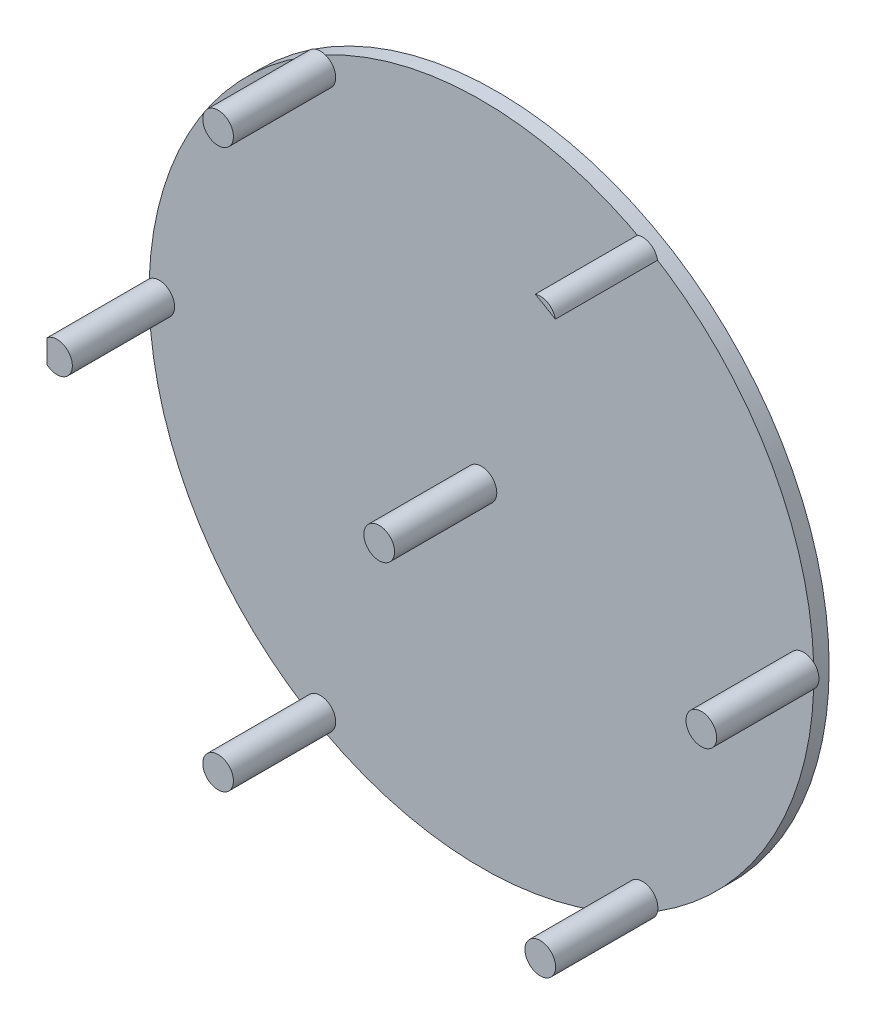
ISO-10303-21;
HEADER;
FILE_DESCRIPTION(('STEP AP214'),'2;1');
FILE_NAME('part.step','',(''),(''),'','','');
FILE_SCHEMA(('AUTOMOTIVE_DESIGN { 1 0 10303 214 1 1 1 1 }'));
ENDSEC;
DATA;
#1=APPLICATION_CONTEXT('core data for automotive mechanical design processes');
#2=APPLICATION_PROTOCOL_DEFINITION('international standard','automotive_design',2000,#1);
#3=PRODUCT_CONTEXT('',#1,'mechanical');
#4=PRODUCT('Part','Part','',(#3));
#5=PRODUCT_RELATED_PRODUCT_CATEGORY('part','',(#4));
#6=PRODUCT_DEFINITION_FORMATION('','',#4);
#7=PRODUCT_DEFINITION_CONTEXT('part definition',#1,'design');
#8=PRODUCT_DEFINITION('design','',#6,#7);
#9=PRODUCT_DEFINITION_SHAPE('','',#8);
#10=(LENGTH_UNIT() NAMED_UNIT(*) SI_UNIT(.MILLI.,.METRE.));
#11=(NAMED_UNIT(*) PLANE_ANGLE_UNIT() SI_UNIT($,.RADIAN.));
#12=(NAMED_UNIT(*) SI_UNIT($,.STERADIAN.) SOLID_ANGLE_UNIT());
#13=UNCERTAINTY_MEASURE_WITH_UNIT(LENGTH_MEASURE(1.E-05),#10,'distance_accuracy_value','');
#14=(GEOMETRIC_REPRESENTATION_CONTEXT(3) GLOBAL_UNCERTAINTY_ASSIGNED_CONTEXT((#13)) GLOBAL_UNIT_ASSIGNED_CONTEXT((#10,
#11,#12)) REPRESENTATION_CONTEXT('',''));
#15=CARTESIAN_POINT('',(0.,0.,0.));
#16=DIRECTION('',(0.,0.,1.));
#17=DIRECTION('',(1.,0.,0.));
#18=AXIS2_PLACEMENT_3D('',#15,#16,#17);
#19=CARTESIAN_POINT('',(0.,0.,20.));
#20=DIRECTION('',(0.,0.,-1.));
#21=DIRECTION('',(-1.,0.,0.));
#22=AXIS2_PLACEMENT_3D('',#19,#20,#21);
#23=CYLINDRICAL_SURFACE('',#22,65.);
#24=CARTESIAN_POINT('',(0.,0.,0.));
#25=DIRECTION('',(0.,0.,1.));
#26=DIRECTION('',(1.,0.,0.));
#27=AXIS2_PLACEMENT_3D('',#24,#25,#26);
#28=CIRCLE('',#27,65.);
#29=CARTESIAN_POINT('',(34.4468479763489,55.1218165928365,0.));
#30=VERTEX_POINT('',#29);
#31=CARTESIAN_POINT('',(30.5134694839685,57.3927537242371,0.));
#32=VERTEX_POINT('',#31);
#33=EDGE_CURVE('E12',#30,#32,#28,.T.);
#34=ORIENTED_EDGE('',*,*,#33,.F.);
#35=DIRECTION('',(0.,0.,-1.));
#36=VECTOR('',#35,1.);
#37=CARTESIAN_POINT('',(34.4468479763489,55.1218165928365,20.));
#38=LINE('',#37,#36);
#39=CARTESIAN_POINT('',(34.4468479763489,55.1218165928365,20.));
#40=VERTEX_POINT('',#39);
#41=EDGE_CURVE('E72',#40,#30,#38,.T.);
#42=ORIENTED_EDGE('',*,*,#41,.F.);
#43=CARTESIAN_POINT('',(0.,0.,20.));
#44=DIRECTION('',(0.,0.,1.));
#45=DIRECTION('',(1.,0.,0.));
#46=AXIS2_PLACEMENT_3D('',#43,#44,#45);
#47=CIRCLE('',#46,65.);
#48=CARTESIAN_POINT('',(30.5134694839685,57.3927537242371,20.));
#49=VERTEX_POINT('',#48);
#50=EDGE_CURVE('E57',#40,#49,#47,.T.);
#51=ORIENTED_EDGE('',*,*,#50,.T.);
#52=DIRECTION('',(0.,0.,-1.));
#53=VECTOR('',#52,1.);
#54=CARTESIAN_POINT('',(30.5134694839685,57.3927537242371,20.));
#55=LINE('',#54,#53);
#56=EDGE_CURVE('E85',#49,#32,#55,.T.);
#57=ORIENTED_EDGE('',*,*,#56,.T.);
#58=EDGE_LOOP('',(#34,#42,#51,#57));
#59=FACE_BOUND('',#58,.T.);
#60=ADVANCED_FACE('F53',(#59),#23,.F.);
#61=CARTESIAN_POINT('',(31.5,54.5596004384197,20.));
#62=DIRECTION('',(0.,0.,-1.));
#63=DIRECTION('',(-1.,0.,0.));
#64=AXIS2_PLACEMENT_3D('',#61,#62,#63);
#65=CYLINDRICAL_SURFACE('',#64,3.);
#66=CARTESIAN_POINT('',(31.5,54.5596004384197,0.));
#67=DIRECTION('',(0.,0.,1.));
#68=DIRECTION('',(1.,0.,0.));
#69=AXIS2_PLACEMENT_3D('',#66,#67,#68);
#70=CIRCLE('',#69,3.);
#71=EDGE_CURVE('E63',#30,#32,#70,.T.);
#72=ORIENTED_EDGE('',*,*,#71,.T.);
#73=ORIENTED_EDGE('',*,*,#56,.F.);
#74=CARTESIAN_POINT('',(31.5,54.5596004384197,20.));
#75=DIRECTION('',(0.,0.,1.));
#76=DIRECTION('',(1.,0.,0.));
#77=AXIS2_PLACEMENT_3D('',#74,#75,#76);
#78=CIRCLE('',#77,3.);
#79=EDGE_CURVE('E80',#40,#49,#78,.T.);
#80=ORIENTED_EDGE('',*,*,#79,.F.);
#81=ORIENTED_EDGE('',*,*,#41,.T.);
#82=EDGE_LOOP('',(#72,#73,#80,#81));
#83=FACE_BOUND('',#82,.T.);
#84=ADVANCED_FACE('F87',(#83),#65,.T.);
#85=CARTESIAN_POINT('',(0.,0.,20.));
#86=DIRECTION('',(0.,0.,1.));
#87=DIRECTION('',(1.,0.,0.));
#88=AXIS2_PLACEMENT_3D('',#85,#86,#87);
#89=PLANE('',#88);
#90=ORIENTED_EDGE('',*,*,#50,.F.);
#91=ORIENTED_EDGE('',*,*,#79,.T.);
#92=EDGE_LOOP('',(#90,#91));
#93=FACE_BOUND('',#92,.T.);
#94=ADVANCED_FACE('F55',(#93),#89,.T.);
#95=CARTESIAN_POINT('',(0.,0.,0.));
#96=DIRECTION('',(0.,0.,1.));
#97=DIRECTION('',(1.,0.,0.));
#98=AXIS2_PLACEMENT_3D('',#95,#96,#97);
#99=PLANE('',#98);
#100=ORIENTED_EDGE('',*,*,#33,.T.);
#101=ORIENTED_EDGE('',*,*,#71,.F.);
#102=EDGE_LOOP('',(#100,#101));
#103=FACE_BOUND('',#102,.T.);
#104=ADVANCED_FACE('F91',(#103),#99,.F.);
#105=CLOSED_SHELL('',(#60,#84,#94,#104));
#106=MANIFOLD_SOLID_BREP('B2',#105);
#107=CARTESIAN_POINT('',(0.,0.,-3.));
#108=DIRECTION('',(0.,0.,1.));
#109=DIRECTION('',(1.,0.,0.));
#110=AXIS2_PLACEMENT_3D('',#107,#108,#109);
#111=CYLINDRICAL_SURFACE('',#110,65.);
#112=CARTESIAN_POINT('',(0.,0.,-3.));
#113=DIRECTION('',(0.,0.,1.));
#114=DIRECTION('',(1.,0.,0.));
#115=AXIS2_PLACEMENT_3D('',#112,#113,#114);
#116=CIRCLE('',#115,65.);
#117=CARTESIAN_POINT('',(65.,0.,-3.));
#118=VERTEX_POINT('',#117);
#119=EDGE_CURVE('E198',#118,#118,#116,.T.);
#120=ORIENTED_EDGE('',*,*,#119,.T.);
#121=EDGE_LOOP('',(#120));
#122=FACE_BOUND('',#121,.T.);
#123=CARTESIAN_POINT('',(0.,0.,0.));
#124=DIRECTION('',(0.,0.,1.));
#125=DIRECTION('',(1.,0.,0.));
#126=AXIS2_PLACEMENT_3D('',#123,#124,#125);
#127=CIRCLE('',#126,65.);
#128=CARTESIAN_POINT('',(-64.9603174603174,-2.27093713140053,0.));
#129=VERTEX_POINT('',#128);
#130=CARTESIAN_POINT('',(-34.4468479763491,-55.1218165928365,0.));
#131=VERTEX_POINT('',#130);
#132=EDGE_CURVE('E189',#129,#131,#127,.T.);
#133=ORIENTED_EDGE('',*,*,#132,.F.);
#134=DIRECTION('',(0.,0.,-1.));
#135=VECTOR('',#134,1.);
#136=CARTESIAN_POINT('',(-64.9603174603174,-2.27093713140053,20.));
#137=LINE('',#136,#135);
#138=CARTESIAN_POINT('',(-64.9603174603174,-2.27093713140053,20.));
#139=VERTEX_POINT('',#138);
#140=EDGE_CURVE('E213',#139,#129,#137,.T.);
#141=ORIENTED_EDGE('',*,*,#140,.F.);
#142=CARTESIAN_POINT('',(0.,0.,20.));
#143=DIRECTION('',(0.,0.,1.));
#144=DIRECTION('',(1.,0.,0.));
#145=AXIS2_PLACEMENT_3D('',#142,#143,#144);
#146=CIRCLE('',#145,65.);
#147=CARTESIAN_POINT('',(-64.9603174603174,2.27093713140051,20.));
#148=VERTEX_POINT('',#147);
#149=EDGE_CURVE('E236',#148,#139,#146,.T.);
#150=ORIENTED_EDGE('',*,*,#149,.F.);
#151=DIRECTION('',(0.,0.,-1.));
#152=VECTOR('',#151,1.);
#153=CARTESIAN_POINT('',(-64.9603174603174,2.27093713140051,20.));
#154=LINE('',#153,#152);
#155=CARTESIAN_POINT('',(-64.9603174603174,2.27093713140051,0.));
#156=VERTEX_POINT('',#155);
#157=EDGE_CURVE('E215',#148,#156,#154,.T.);
#158=ORIENTED_EDGE('',*,*,#157,.T.);
#159=CARTESIAN_POINT('',(-34.446847976349,55.1218165928365,0.));
#160=VERTEX_POINT('',#159);
#161=EDGE_CURVE('E207',#160,#156,#127,.T.);
#162=ORIENTED_EDGE('',*,*,#161,.F.);
#163=CARTESIAN_POINT('',(-30.5134694839685,57.3927537242372,0.));
#164=VERTEX_POINT('',#163);
#165=EDGE_CURVE('E199',#164,#160,#127,.T.);
#166=ORIENTED_EDGE('',*,*,#165,.F.);
#167=CARTESIAN_POINT('',(64.9603174603175,2.27093713140053,0.));
#168=VERTEX_POINT('',#167);
#169=EDGE_CURVE('E206',#168,#164,#127,.T.);
#170=ORIENTED_EDGE('',*,*,#169,.F.);
#171=CARTESIAN_POINT('',(64.9603174603176,-2.27093713140061,0.));
#172=VERTEX_POINT('',#171);
#173=EDGE_CURVE('E212',#172,#168,#127,.T.);
#174=ORIENTED_EDGE('',*,*,#173,.F.);
#175=CARTESIAN_POINT('',(34.446847976349,-55.1218165928365,0.));
#176=VERTEX_POINT('',#175);
#177=EDGE_CURVE('E194',#176,#172,#127,.T.);
#178=ORIENTED_EDGE('',*,*,#177,.F.);
#179=CARTESIAN_POINT('',(30.5134694839685,-57.3927537242371,0.));
#180=VERTEX_POINT('',#179);
#181=EDGE_CURVE('E204',#180,#176,#127,.T.);
#182=ORIENTED_EDGE('',*,*,#181,.F.);
#183=CARTESIAN_POINT('',(-30.5134694839685,-57.392753724237,0.));
#184=VERTEX_POINT('',#183);
#185=EDGE_CURVE('E192',#184,#180,#127,.T.);
#186=ORIENTED_EDGE('',*,*,#185,.F.);
#187=EDGE_CURVE('E182',#131,#184,#127,.T.);
#188=ORIENTED_EDGE('',*,*,#187,.F.);
#189=EDGE_LOOP('',(#133,#141,#150,#158,#162,#166,#170,#174,#178,#182,#186,#188));
#190=FACE_BOUND('',#189,.T.);
#191=ADVANCED_FACE('F125',(#122,#190),#111,.T.);
#192=CARTESIAN_POINT('',(0.,0.,-3.));
#193=DIRECTION('',(0.,0.,1.));
#194=DIRECTION('',(1.,0.,0.));
#195=AXIS2_PLACEMENT_3D('',#192,#193,#194);
#196=PLANE('',#195);
#197=ORIENTED_EDGE('',*,*,#119,.F.);
#198=EDGE_LOOP('',(#197));
#199=FACE_BOUND('',#198,.T.);
#200=ADVANCED_FACE('F267',(#199),#196,.F.);
#201=CARTESIAN_POINT('',(0.,0.,0.));
#202=DIRECTION('',(0.,0.,1.));
#203=DIRECTION('',(1.,0.,0.));
#204=AXIS2_PLACEMENT_3D('',#201,#202,#203);
#205=PLANE('',#204);
#206=CARTESIAN_POINT('',(0.,0.,0.));
#207=DIRECTION('',(0.,0.,1.));
#208=DIRECTION('',(1.,0.,0.));
#209=AXIS2_PLACEMENT_3D('',#206,#207,#208);
#210=CIRCLE('',#209,3.);
#211=CARTESIAN_POINT('',(3.,0.,0.));
#212=VERTEX_POINT('',#211);
#213=EDGE_CURVE('E285',#212,#212,#210,.T.);
#214=ORIENTED_EDGE('',*,*,#213,.F.);
#215=EDGE_LOOP('',(#214));
#216=FACE_BOUND('',#215,.T.);
#217=ORIENTED_EDGE('',*,*,#132,.T.);
#218=CARTESIAN_POINT('',(-31.5,-54.5596004384197,0.));
#219=DIRECTION('',(0.,0.,1.));
#220=DIRECTION('',(1.,0.,0.));
#221=AXIS2_PLACEMENT_3D('',#218,#219,#220);
#222=CIRCLE('',#221,3.);
#223=EDGE_CURVE('E51',#131,#184,#222,.F.);
#224=ORIENTED_EDGE('',*,*,#223,.T.);
#225=ORIENTED_EDGE('',*,*,#185,.T.);
#226=CARTESIAN_POINT('',(31.5,-54.5596004384196,0.));
#227=DIRECTION('',(0.,0.,1.));
#228=DIRECTION('',(1.,0.,0.));
#229=AXIS2_PLACEMENT_3D('',#226,#227,#228);
#230=CIRCLE('',#229,3.00000000000001);
#231=EDGE_CURVE('E132',#180,#176,#230,.F.);
#232=ORIENTED_EDGE('',*,*,#231,.T.);
#233=ORIENTED_EDGE('',*,*,#177,.T.);
#234=CARTESIAN_POINT('',(63.,0.,0.));
#235=DIRECTION('',(0.,0.,1.));
#236=DIRECTION('',(1.,0.,0.));
#237=AXIS2_PLACEMENT_3D('',#234,#235,#236);
#238=CIRCLE('',#237,3.00000000000001);
#239=EDGE_CURVE('E229',#168,#172,#238,.T.);
#240=ORIENTED_EDGE('',*,*,#239,.F.);
#241=ORIENTED_EDGE('',*,*,#169,.T.);
#242=CARTESIAN_POINT('',(-31.5,54.5596004384196,0.));
#243=DIRECTION('',(0.,0.,1.));
#244=DIRECTION('',(1.,0.,0.));
#245=AXIS2_PLACEMENT_3D('',#242,#243,#244);
#246=CIRCLE('',#245,3.);
#247=EDGE_CURVE('E201',#164,#160,#246,.F.);
#248=ORIENTED_EDGE('',*,*,#247,.T.);
#249=ORIENTED_EDGE('',*,*,#161,.T.);
#250=CARTESIAN_POINT('',(-63.,0.,0.));
#251=DIRECTION('',(0.,0.,1.));
#252=DIRECTION('',(1.,0.,0.));
#253=AXIS2_PLACEMENT_3D('',#250,#251,#252);
#254=CIRCLE('',#253,3.00000000000001);
#255=EDGE_CURVE('E197',#129,#156,#254,.T.);
#256=ORIENTED_EDGE('',*,*,#255,.F.);
#257=EDGE_LOOP('',(#217,#224,#225,#232,#233,#240,#241,#248,#249,#256));
#258=FACE_BOUND('',#257,.T.);
#259=ADVANCED_FACE('F195',(#216,#258),#205,.T.);
#260=CARTESIAN_POINT('',(-63.,0.,20.));
#261=DIRECTION('',(0.,0.,-1.));
#262=DIRECTION('',(-1.,0.,0.));
#263=AXIS2_PLACEMENT_3D('',#260,#261,#262);
#264=CYLINDRICAL_SURFACE('',#263,3.00000000000001);
#265=ORIENTED_EDGE('',*,*,#255,.T.);
#266=ORIENTED_EDGE('',*,*,#157,.F.);
#267=CARTESIAN_POINT('',(-63.,0.,20.));
#268=DIRECTION('',(0.,0.,1.));
#269=DIRECTION('',(1.,0.,0.));
#270=AXIS2_PLACEMENT_3D('',#267,#268,#269);
#271=CIRCLE('',#270,3.00000000000001);
#272=EDGE_CURVE('E246',#139,#148,#271,.T.);
#273=ORIENTED_EDGE('',*,*,#272,.F.);
#274=ORIENTED_EDGE('',*,*,#140,.T.);
#275=EDGE_LOOP('',(#265,#266,#273,#274));
#276=FACE_BOUND('',#275,.T.);
#277=ADVANCED_FACE('F252',(#276),#264,.T.);
#278=CARTESIAN_POINT('',(0.,0.,20.));
#279=DIRECTION('',(0.,0.,1.));
#280=DIRECTION('',(1.,0.,0.));
#281=AXIS2_PLACEMENT_3D('',#278,#279,#280);
#282=PLANE('',#281);
#283=ORIENTED_EDGE('',*,*,#149,.T.);
#284=ORIENTED_EDGE('',*,*,#272,.T.);
#285=EDGE_LOOP('',(#283,#284));
#286=FACE_BOUND('',#285,.T.);
#287=ADVANCED_FACE('F254',(#286),#282,.T.);
#288=CARTESIAN_POINT('',(-31.5,54.5596004384196,20.));
#289=DIRECTION('',(0.,0.,-1.));
#290=DIRECTION('',(-1.,0.,0.));
#291=AXIS2_PLACEMENT_3D('',#288,#289,#290);
#292=CYLINDRICAL_SURFACE('',#291,3.);
#293=CARTESIAN_POINT('',(-31.5,54.5596004384196,20.));
#294=DIRECTION('',(0.,0.,1.));
#295=DIRECTION('',(1.,0.,0.));
#296=AXIS2_PLACEMENT_3D('',#293,#294,#295);
#297=CIRCLE('',#296,3.);
#298=CARTESIAN_POINT('',(-28.5,54.5596004384196,20.));
#299=VERTEX_POINT('',#298);
#300=EDGE_CURVE('E234',#299,#299,#297,.T.);
#301=ORIENTED_EDGE('',*,*,#300,.F.);
#302=EDGE_LOOP('',(#301));
#303=FACE_BOUND('',#302,.T.);
#304=CARTESIAN_POINT('',(-31.5,54.5596004384196,0.));
#305=DIRECTION('',(0.,0.,1.));
#306=DIRECTION('',(1.,0.,0.));
#307=AXIS2_PLACEMENT_3D('',#304,#305,#306);
#308=CIRCLE('',#307,3.);
#309=EDGE_CURVE('E232',#164,#160,#308,.T.);
#310=ORIENTED_EDGE('',*,*,#309,.T.);
#311=ORIENTED_EDGE('',*,*,#247,.F.);
#312=EDGE_LOOP('',(#310,#311));
#313=FACE_BOUND('',#312,.T.);
#314=ADVANCED_FACE('F231',(#303,#313),#292,.T.);
#315=CARTESIAN_POINT('',(-31.5,54.5596004384196,20.));
#316=DIRECTION('',(0.,0.,1.));
#317=DIRECTION('',(1.,0.,0.));
#318=AXIS2_PLACEMENT_3D('',#315,#316,#317);
#319=PLANE('',#318);
#320=ORIENTED_EDGE('',*,*,#300,.T.);
#321=EDGE_LOOP('',(#320));
#322=FACE_BOUND('',#321,.T.);
#323=ADVANCED_FACE('F261',(#322),#319,.T.);
#324=CARTESIAN_POINT('',(-31.5,54.5596004384196,0.));
#325=DIRECTION('',(0.,0.,1.));
#326=DIRECTION('',(1.,0.,0.));
#327=AXIS2_PLACEMENT_3D('',#324,#325,#326);
#328=PLANE('',#327);
#329=ORIENTED_EDGE('',*,*,#165,.T.);
#330=ORIENTED_EDGE('',*,*,#309,.F.);
#331=EDGE_LOOP('',(#329,#330));
#332=FACE_BOUND('',#331,.T.);
#333=ADVANCED_FACE('F233',(#332),#328,.F.);
#334=CARTESIAN_POINT('',(63.,0.,20.));
#335=DIRECTION('',(0.,0.,-1.));
#336=DIRECTION('',(-1.,0.,0.));
#337=AXIS2_PLACEMENT_3D('',#334,#335,#336);
#338=CYLINDRICAL_SURFACE('',#337,3.00000000000001);
#339=CARTESIAN_POINT('',(63.,0.,20.));
#340=DIRECTION('',(0.,0.,1.));
#341=DIRECTION('',(1.,0.,0.));
#342=AXIS2_PLACEMENT_3D('',#339,#340,#341);
#343=CIRCLE('',#342,3.00000000000001);
#344=CARTESIAN_POINT('',(66.,0.,20.));
#345=VERTEX_POINT('',#344);
#346=EDGE_CURVE('E241',#345,#345,#343,.T.);
#347=ORIENTED_EDGE('',*,*,#346,.F.);
#348=EDGE_LOOP('',(#347));
#349=FACE_BOUND('',#348,.T.);
#350=ORIENTED_EDGE('',*,*,#239,.T.);
#351=EDGE_CURVE('E296',#172,#168,#238,.T.);
#352=ORIENTED_EDGE('',*,*,#351,.T.);
#353=EDGE_LOOP('',(#350,#352));
#354=FACE_BOUND('',#353,.T.);
#355=ADVANCED_FACE('F303',(#349,#354),#338,.T.);
#356=CARTESIAN_POINT('',(63.,0.,20.));
#357=DIRECTION('',(0.,0.,1.));
#358=DIRECTION('',(1.,0.,0.));
#359=AXIS2_PLACEMENT_3D('',#356,#357,#358);
#360=PLANE('',#359);
#361=ORIENTED_EDGE('',*,*,#346,.T.);
#362=EDGE_LOOP('',(#361));
#363=FACE_BOUND('',#362,.T.);
#364=ADVANCED_FACE('F301',(#363),#360,.T.);
#365=CARTESIAN_POINT('',(63.,0.,0.));
#366=DIRECTION('',(0.,0.,1.));
#367=DIRECTION('',(1.,0.,0.));
#368=AXIS2_PLACEMENT_3D('',#365,#366,#367);
#369=PLANE('',#368);
#370=ORIENTED_EDGE('',*,*,#173,.T.);
#371=ORIENTED_EDGE('',*,*,#351,.F.);
#372=EDGE_LOOP('',(#370,#371));
#373=FACE_BOUND('',#372,.T.);
#374=ADVANCED_FACE('F310',(#373),#369,.F.);
#375=CARTESIAN_POINT('',(31.5,-54.5596004384196,20.));
#376=DIRECTION('',(0.,0.,-1.));
#377=DIRECTION('',(-1.,0.,0.));
#378=AXIS2_PLACEMENT_3D('',#375,#376,#377);
#379=CYLINDRICAL_SURFACE('',#378,3.00000000000001);
#380=CARTESIAN_POINT('',(31.5,-54.5596004384196,20.));
#381=DIRECTION('',(0.,0.,1.));
#382=DIRECTION('',(1.,0.,0.));
#383=AXIS2_PLACEMENT_3D('',#380,#381,#382);
#384=CIRCLE('',#383,3.00000000000001);
#385=CARTESIAN_POINT('',(34.5,-54.5596004384196,20.));
#386=VERTEX_POINT('',#385);
#387=EDGE_CURVE('E183',#386,#386,#384,.T.);
#388=ORIENTED_EDGE('',*,*,#387,.F.);
#389=EDGE_LOOP('',(#388));
#390=FACE_BOUND('',#389,.T.);
#391=CARTESIAN_POINT('',(31.5,-54.5596004384196,0.));
#392=DIRECTION('',(0.,0.,1.));
#393=DIRECTION('',(1.,0.,0.));
#394=AXIS2_PLACEMENT_3D('',#391,#392,#393);
#395=CIRCLE('',#394,3.00000000000001);
#396=EDGE_CURVE('E145',#180,#176,#395,.T.);
#397=ORIENTED_EDGE('',*,*,#396,.T.);
#398=ORIENTED_EDGE('',*,*,#231,.F.);
#399=EDGE_LOOP('',(#397,#398));
#400=FACE_BOUND('',#399,.T.);
#401=ADVANCED_FACE('F318',(#390,#400),#379,.T.);
#402=CARTESIAN_POINT('',(31.5,-54.5596004384196,20.));
#403=DIRECTION('',(0.,0.,1.));
#404=DIRECTION('',(1.,0.,0.));
#405=AXIS2_PLACEMENT_3D('',#402,#403,#404);
#406=PLANE('',#405);
#407=ORIENTED_EDGE('',*,*,#387,.T.);
#408=EDGE_LOOP('',(#407));
#409=FACE_BOUND('',#408,.T.);
#410=ADVANCED_FACE('F315',(#409),#406,.T.);
#411=CARTESIAN_POINT('',(31.5,-54.5596004384196,0.));
#412=DIRECTION('',(0.,0.,1.));
#413=DIRECTION('',(1.,0.,0.));
#414=AXIS2_PLACEMENT_3D('',#411,#412,#413);
#415=PLANE('',#414);
#416=ORIENTED_EDGE('',*,*,#181,.T.);
#417=ORIENTED_EDGE('',*,*,#396,.F.);
#418=EDGE_LOOP('',(#416,#417));
#419=FACE_BOUND('',#418,.T.);
#420=ADVANCED_FACE('F225',(#419),#415,.F.);
#421=CARTESIAN_POINT('',(-31.5,-54.5596004384197,20.));
#422=DIRECTION('',(0.,0.,-1.));
#423=DIRECTION('',(-1.,0.,0.));
#424=AXIS2_PLACEMENT_3D('',#421,#422,#423);
#425=CYLINDRICAL_SURFACE('',#424,3.);
#426=CARTESIAN_POINT('',(-31.5,-54.5596004384197,20.));
#427=DIRECTION('',(0.,0.,1.));
#428=DIRECTION('',(1.,0.,0.));
#429=AXIS2_PLACEMENT_3D('',#426,#427,#428);
#430=CIRCLE('',#429,3.);
#431=CARTESIAN_POINT('',(-28.5,-54.5596004384197,20.));
#432=VERTEX_POINT('',#431);
#433=EDGE_CURVE('E184',#432,#432,#430,.T.);
#434=ORIENTED_EDGE('',*,*,#433,.F.);
#435=EDGE_LOOP('',(#434));
#436=FACE_BOUND('',#435,.T.);
#437=CARTESIAN_POINT('',(-31.5,-54.5596004384197,0.));
#438=DIRECTION('',(0.,0.,1.));
#439=DIRECTION('',(1.,0.,0.));
#440=AXIS2_PLACEMENT_3D('',#437,#438,#439);
#441=CIRCLE('',#440,3.);
#442=EDGE_CURVE('E138',#131,#184,#441,.T.);
#443=ORIENTED_EDGE('',*,*,#442,.T.);
#444=ORIENTED_EDGE('',*,*,#223,.F.);
#445=EDGE_LOOP('',(#443,#444));
#446=FACE_BOUND('',#445,.T.);
#447=ADVANCED_FACE('F175',(#436,#446),#425,.T.);
#448=CARTESIAN_POINT('',(-31.5,-54.5596004384197,20.));
#449=DIRECTION('',(0.,0.,1.));
#450=DIRECTION('',(1.,0.,0.));
#451=AXIS2_PLACEMENT_3D('',#448,#449,#450);
#452=PLANE('',#451);
#453=ORIENTED_EDGE('',*,*,#433,.T.);
#454=EDGE_LOOP('',(#453));
#455=FACE_BOUND('',#454,.T.);
#456=ADVANCED_FACE('F381',(#455),#452,.T.);
#457=CARTESIAN_POINT('',(-31.5,-54.5596004384197,0.));
#458=DIRECTION('',(0.,0.,1.));
#459=DIRECTION('',(1.,0.,0.));
#460=AXIS2_PLACEMENT_3D('',#457,#458,#459);
#461=PLANE('',#460);
#462=ORIENTED_EDGE('',*,*,#187,.T.);
#463=ORIENTED_EDGE('',*,*,#442,.F.);
#464=EDGE_LOOP('',(#462,#463));
#465=FACE_BOUND('',#464,.T.);
#466=ADVANCED_FACE('F181',(#465),#461,.F.);
#467=CARTESIAN_POINT('',(0.,0.,20.));
#468=DIRECTION('',(0.,0.,-1.));
#469=DIRECTION('',(-1.,0.,0.));
#470=AXIS2_PLACEMENT_3D('',#467,#468,#469);
#471=CYLINDRICAL_SURFACE('',#470,3.);
#472=CARTESIAN_POINT('',(0.,0.,20.));
#473=DIRECTION('',(0.,0.,1.));
#474=DIRECTION('',(1.,0.,0.));
#475=AXIS2_PLACEMENT_3D('',#472,#473,#474);
#476=CIRCLE('',#475,3.);
#477=CARTESIAN_POINT('',(3.,0.,20.));
#478=VERTEX_POINT('',#477);
#479=EDGE_CURVE('E287',#478,#478,#476,.T.);
#480=ORIENTED_EDGE('',*,*,#479,.F.);
#481=EDGE_LOOP('',(#480));
#482=FACE_BOUND('',#481,.T.);
#483=ORIENTED_EDGE('',*,*,#213,.T.);
#484=EDGE_LOOP('',(#483));
#485=FACE_BOUND('',#484,.T.);
#486=ADVANCED_FACE('F399',(#482,#485),#471,.T.);
#487=CARTESIAN_POINT('',(0.,0.,20.));
#488=DIRECTION('',(0.,0.,1.));
#489=DIRECTION('',(1.,0.,0.));
#490=AXIS2_PLACEMENT_3D('',#487,#488,#489);
#491=PLANE('',#490);
#492=ORIENTED_EDGE('',*,*,#479,.T.);
#493=EDGE_LOOP('',(#492));
#494=FACE_BOUND('',#493,.T.);
#495=ADVANCED_FACE('F407',(#494),#491,.T.);
#496=CLOSED_SHELL('',(#191,#200,#259,#277,#287,#314,#323,#333,#355,#364,#374,#401,#410,#420,
#447,#456,#466,#486,#495));
#497=MANIFOLD_SOLID_BREP('B6',#496);
#498=ADVANCED_BREP_SHAPE_REPRESENTATION('',(#18,#106,#497),#14);
#499=SHAPE_DEFINITION_REPRESENTATION(#9,#498);
ENDSEC;
END-ISO-10303-21;
